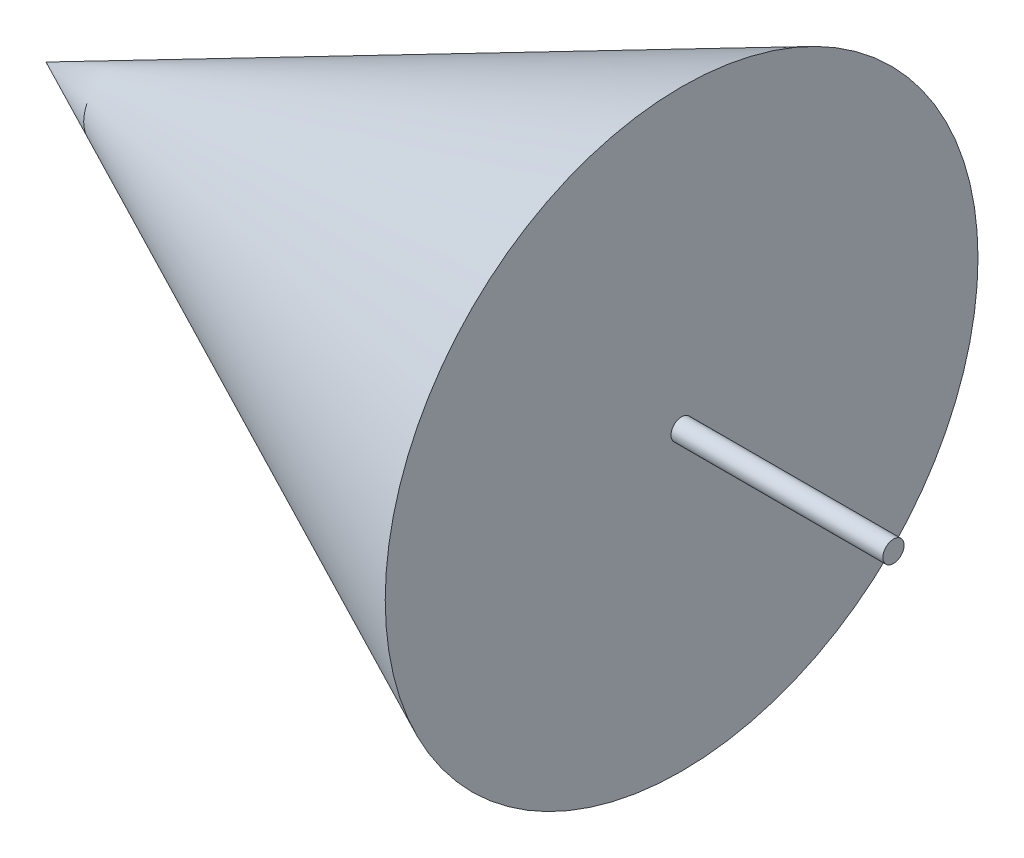
ISO-10303-21;
HEADER;
FILE_DESCRIPTION(('STEP AP214'),'2;1');
FILE_NAME('part.step','',(''),(''),'','','');
FILE_SCHEMA(('AUTOMOTIVE_DESIGN { 1 0 10303 214 1 1 1 1 }'));
ENDSEC;
DATA;
#1=APPLICATION_CONTEXT('core data for automotive mechanical design processes');
#2=APPLICATION_PROTOCOL_DEFINITION('international standard','automotive_design',2000,#1);
#3=PRODUCT_CONTEXT('',#1,'mechanical');
#4=PRODUCT('Part','Part','',(#3));
#5=PRODUCT_RELATED_PRODUCT_CATEGORY('part','',(#4));
#6=PRODUCT_DEFINITION_FORMATION('','',#4);
#7=PRODUCT_DEFINITION_CONTEXT('part definition',#1,'design');
#8=PRODUCT_DEFINITION('design','',#6,#7);
#9=PRODUCT_DEFINITION_SHAPE('','',#8);
#10=(LENGTH_UNIT() NAMED_UNIT(*) SI_UNIT(.MILLI.,.METRE.));
#11=(NAMED_UNIT(*) PLANE_ANGLE_UNIT() SI_UNIT($,.RADIAN.));
#12=(NAMED_UNIT(*) SI_UNIT($,.STERADIAN.) SOLID_ANGLE_UNIT());
#13=UNCERTAINTY_MEASURE_WITH_UNIT(LENGTH_MEASURE(1.E-05),#10,'distance_accuracy_value','');
#14=(GEOMETRIC_REPRESENTATION_CONTEXT(3) GLOBAL_UNCERTAINTY_ASSIGNED_CONTEXT((#13)) GLOBAL_UNIT_ASSIGNED_CONTEXT((#10,
#11,#12)) REPRESENTATION_CONTEXT('',''));
#15=CARTESIAN_POINT('',(0.,0.,0.));
#16=DIRECTION('',(0.,0.,1.));
#17=DIRECTION('',(1.,0.,0.));
#18=AXIS2_PLACEMENT_3D('',#15,#16,#17);
#19=CARTESIAN_POINT('',(6.,0.,0.));
#20=DIRECTION('',(1.,0.,0.));
#21=DIRECTION('',(0.,1.,0.));
#22=AXIS2_PLACEMENT_3D('',#19,#20,#21);
#23=CONICAL_SURFACE('',#22,2.79784594893,0.436332312998584);
#24=CARTESIAN_POINT('',(0.,0.,0.));
#25=VERTEX_POINT('',#24);
#26=VERTEX_LOOP('',#25);
#27=FACE_BOUND('',#26,.T.);
#28=CARTESIAN_POINT('',(6.,0.,0.));
#29=DIRECTION('',(-1.,0.,0.));
#30=DIRECTION('',(0.,-1.,0.));
#31=AXIS2_PLACEMENT_3D('',#28,#29,#30);
#32=CIRCLE('',#31,2.79784594893);
#33=CARTESIAN_POINT('',(6.,-2.79784594893,0.));
#34=VERTEX_POINT('',#33);
#35=EDGE_CURVE('E11',#34,#34,#32,.T.);
#36=ORIENTED_EDGE('',*,*,#35,.T.);
#37=EDGE_LOOP('',(#36));
#38=FACE_BOUND('',#37,.T.);
#39=ADVANCED_FACE('F32',(#27,#38),#23,.T.);
#40=CARTESIAN_POINT('',(6.,2.79784594893,0.));
#41=DIRECTION('',(-1.,0.,0.));
#42=DIRECTION('',(0.,-1.,0.));
#43=AXIS2_PLACEMENT_3D('',#40,#41,#42);
#44=PLANE('',#43);
#45=ORIENTED_EDGE('',*,*,#35,.F.);
#46=EDGE_LOOP('',(#45));
#47=FACE_BOUND('',#46,.T.);
#48=CARTESIAN_POINT('',(6.,0.,0.));
#49=DIRECTION('',(-1.,0.,0.));
#50=DIRECTION('',(0.,-1.,0.));
#51=AXIS2_PLACEMENT_3D('',#48,#49,#50);
#52=CIRCLE('',#51,0.0999999999999991);
#53=CARTESIAN_POINT('',(6.,-0.0999999999999984,0.));
#54=VERTEX_POINT('',#53);
#55=EDGE_CURVE('E38',#54,#54,#52,.T.);
#56=ORIENTED_EDGE('',*,*,#55,.T.);
#57=EDGE_LOOP('',(#56));
#58=FACE_BOUND('',#57,.T.);
#59=ADVANCED_FACE('F43',(#47,#58),#44,.F.);
#60=CARTESIAN_POINT('',(0.,0.,0.));
#61=DIRECTION('',(-1.,0.,0.));
#62=DIRECTION('',(0.,-1.,0.));
#63=AXIS2_PLACEMENT_3D('',#60,#61,#62);
#64=CYLINDRICAL_SURFACE('',#63,0.0999999999999991);
#65=ORIENTED_EDGE('',*,*,#55,.F.);
#66=EDGE_LOOP('',(#65));
#67=FACE_BOUND('',#66,.T.);
#68=CARTESIAN_POINT('',(8.,0.,0.));
#69=DIRECTION('',(-1.,0.,0.));
#70=DIRECTION('',(0.,-1.,0.));
#71=AXIS2_PLACEMENT_3D('',#68,#69,#70);
#72=CIRCLE('',#71,0.099999999999999);
#73=CARTESIAN_POINT('',(8.,-0.099999999999998,0.));
#74=VERTEX_POINT('',#73);
#75=EDGE_CURVE('E52',#74,#74,#72,.T.);
#76=ORIENTED_EDGE('',*,*,#75,.T.);
#77=EDGE_LOOP('',(#76));
#78=FACE_BOUND('',#77,.T.);
#79=ADVANCED_FACE('F48',(#67,#78),#64,.T.);
#80=CARTESIAN_POINT('',(8.,0.1,0.));
#81=DIRECTION('',(-1.,0.,0.));
#82=DIRECTION('',(0.,-1.,0.));
#83=AXIS2_PLACEMENT_3D('',#80,#81,#82);
#84=PLANE('',#83);
#85=ORIENTED_EDGE('',*,*,#75,.F.);
#86=EDGE_LOOP('',(#85));
#87=FACE_BOUND('',#86,.T.);
#88=ADVANCED_FACE('F58',(#87),#84,.F.);
#89=CLOSED_SHELL('',(#39,#59,#79,#88));
#90=MANIFOLD_SOLID_BREP('B2',#89);
#91=ADVANCED_BREP_SHAPE_REPRESENTATION('',(#18,#90),#14);
#92=SHAPE_DEFINITION_REPRESENTATION(#9,#91);
ENDSEC;
END-ISO-10303-21;
